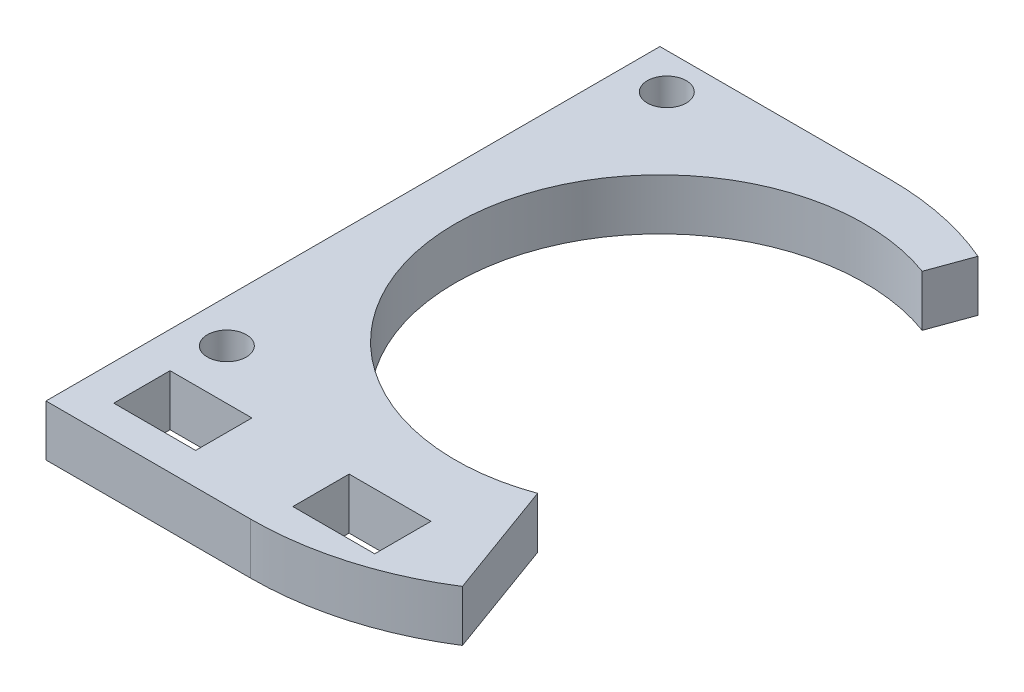
ISO-10303-21;
HEADER;
FILE_DESCRIPTION(('STEP AP214'),'2;1');
FILE_NAME('part.step','',(''),(''),'','','');
FILE_SCHEMA(('AUTOMOTIVE_DESIGN { 1 0 10303 214 1 1 1 1 }'));
ENDSEC;
DATA;
#1=APPLICATION_CONTEXT('core data for automotive mechanical design processes');
#2=APPLICATION_PROTOCOL_DEFINITION('international standard','automotive_design',2000,#1);
#3=PRODUCT_CONTEXT('',#1,'mechanical');
#4=PRODUCT('Part','Part','',(#3));
#5=PRODUCT_RELATED_PRODUCT_CATEGORY('part','',(#4));
#6=PRODUCT_DEFINITION_FORMATION('','',#4);
#7=PRODUCT_DEFINITION_CONTEXT('part definition',#1,'design');
#8=PRODUCT_DEFINITION('design','',#6,#7);
#9=PRODUCT_DEFINITION_SHAPE('','',#8);
#10=(LENGTH_UNIT() NAMED_UNIT(*) SI_UNIT(.MILLI.,.METRE.));
#11=(NAMED_UNIT(*) PLANE_ANGLE_UNIT() SI_UNIT($,.RADIAN.));
#12=(NAMED_UNIT(*) SI_UNIT($,.STERADIAN.) SOLID_ANGLE_UNIT());
#13=UNCERTAINTY_MEASURE_WITH_UNIT(LENGTH_MEASURE(1.E-05),#10,'distance_accuracy_value','');
#14=(GEOMETRIC_REPRESENTATION_CONTEXT(3) GLOBAL_UNCERTAINTY_ASSIGNED_CONTEXT((#13)) GLOBAL_UNIT_ASSIGNED_CONTEXT((#10,
#11,#12)) REPRESENTATION_CONTEXT('',''));
#15=CARTESIAN_POINT('',(0.,0.,0.));
#16=DIRECTION('',(0.,0.,1.));
#17=DIRECTION('',(1.,0.,0.));
#18=AXIS2_PLACEMENT_3D('',#15,#16,#17);
#19=CARTESIAN_POINT('',(9.,2.,-13.));
#20=DIRECTION('',(0.,1.,0.));
#21=DIRECTION('',(0.,0.,1.));
#22=AXIS2_PLACEMENT_3D('',#19,#20,#21);
#23=PLANE('',#22);
#24=DIRECTION('',(-0.342020143325673,0.,0.939692620785907));
#25=VECTOR('',#24,1.);
#26=CARTESIAN_POINT('',(14.4183359517075,2.,-26.1392782588811));
#27=LINE('',#26,#25);
#28=CARTESIAN_POINT('',(13.3182925325843,2.,-23.1169338044205));
#29=VERTEX_POINT('',#28);
#30=CARTESIAN_POINT('',(12.7361611466052,2.,-21.5175409662873));
#31=VERTEX_POINT('',#30);
#32=EDGE_CURVE('E55',#29,#31,#27,.T.);
#33=ORIENTED_EDGE('',*,*,#32,.F.);
#34=CARTESIAN_POINT('',(9.,2.,-13.));
#35=DIRECTION('',(0.,1.,0.));
#36=DIRECTION('',(0.,0.,1.));
#37=AXIS2_PLACEMENT_3D('',#34,#35,#36);
#38=CIRCLE('',#37,11.);
#39=CARTESIAN_POINT('',(9.,2.,-24.));
#40=VERTEX_POINT('',#39);
#41=EDGE_CURVE('E178',#29,#40,#38,.T.);
#42=ORIENTED_EDGE('',*,*,#41,.T.);
#43=DIRECTION('',(-1.,0.,0.));
#44=VECTOR('',#43,1.);
#45=CARTESIAN_POINT('',(0.,2.,-24.));
#46=LINE('',#45,#44);
#47=CARTESIAN_POINT('',(0.,2.,-24.));
#48=VERTEX_POINT('',#47);
#49=EDGE_CURVE('E180',#40,#48,#46,.T.);
#50=ORIENTED_EDGE('',*,*,#49,.T.);
#51=DIRECTION('',(0.,0.,1.));
#52=VECTOR('',#51,1.);
#53=CARTESIAN_POINT('',(0.,2.,0.));
#54=LINE('',#53,#52);
#55=CARTESIAN_POINT('',(0.,2.,0.));
#56=VERTEX_POINT('',#55);
#57=EDGE_CURVE('E171',#48,#56,#54,.T.);
#58=ORIENTED_EDGE('',*,*,#57,.T.);
#59=DIRECTION('',(1.,0.,0.));
#60=VECTOR('',#59,1.);
#61=CARTESIAN_POINT('',(0.,2.,0.));
#62=LINE('',#61,#60);
#63=CARTESIAN_POINT('',(8.,2.,0.));
#64=VERTEX_POINT('',#63);
#65=EDGE_CURVE('E174',#56,#64,#62,.T.);
#66=ORIENTED_EDGE('',*,*,#65,.T.);
#67=CARTESIAN_POINT('',(8.,2.,-12.));
#68=DIRECTION('',(0.,1.,0.));
#69=DIRECTION('',(0.,0.,-1.));
#70=AXIS2_PLACEMENT_3D('',#67,#68,#69);
#71=CIRCLE('',#70,12.);
#72=CARTESIAN_POINT('',(14.4183359517075,2.,-1.86072174111888));
#73=VERTEX_POINT('',#72);
#74=EDGE_CURVE('E157',#64,#73,#71,.T.);
#75=ORIENTED_EDGE('',*,*,#74,.T.);
#76=DIRECTION('',(0.342020143325673,0.,0.939692620785907));
#77=VECTOR('',#76,1.);
#78=CARTESIAN_POINT('',(12.7361611466052,2.,-6.48245903371269));
#79=LINE('',#78,#77);
#80=CARTESIAN_POINT('',(12.7361611466052,2.,-6.48245903371269));
#81=VERTEX_POINT('',#80);
#82=EDGE_CURVE('E144',#81,#73,#79,.T.);
#83=ORIENTED_EDGE('',*,*,#82,.F.);
#84=CARTESIAN_POINT('',(10.,2.,-14.));
#85=DIRECTION('',(0.,1.,0.));
#86=DIRECTION('',(0.,0.,1.));
#87=AXIS2_PLACEMENT_3D('',#84,#85,#86);
#88=CIRCLE('',#87,8.);
#89=EDGE_CURVE('E155',#31,#81,#88,.T.);
#90=ORIENTED_EDGE('',*,*,#89,.F.);
#91=EDGE_LOOP('',(#33,#42,#50,#58,#66,#75,#83,#90));
#92=FACE_BOUND('',#91,.T.);
#93=CARTESIAN_POINT('',(1.67,2.,-22.6));
#94=DIRECTION('',(0.,1.,0.));
#95=DIRECTION('',(0.,0.,1.));
#96=AXIS2_PLACEMENT_3D('',#93,#94,#95);
#97=CIRCLE('',#96,0.759999999999998);
#98=CARTESIAN_POINT('',(1.67,2.,-21.84));
#99=VERTEX_POINT('',#98);
#100=EDGE_CURVE('E264',#99,#99,#97,.T.);
#101=ORIENTED_EDGE('',*,*,#100,.F.);
#102=EDGE_LOOP('',(#101));
#103=FACE_BOUND('',#102,.T.);
#104=DIRECTION('',(-1.,0.,0.));
#105=VECTOR('',#104,1.);
#106=CARTESIAN_POINT('',(8.4,2.,-3.45));
#107=LINE('',#106,#105);
#108=CARTESIAN_POINT('',(11.6,2.,-3.45));
#109=VERTEX_POINT('',#108);
#110=CARTESIAN_POINT('',(8.4,2.,-3.45));
#111=VERTEX_POINT('',#110);
#112=EDGE_CURVE('E272',#109,#111,#107,.T.);
#113=ORIENTED_EDGE('',*,*,#112,.F.);
#114=DIRECTION('',(0.,0.,-1.));
#115=VECTOR('',#114,1.);
#116=CARTESIAN_POINT('',(11.6,2.,-3.45));
#117=LINE('',#116,#115);
#118=CARTESIAN_POINT('',(11.6,2.,-1.25));
#119=VERTEX_POINT('',#118);
#120=EDGE_CURVE('E270',#119,#109,#117,.T.);
#121=ORIENTED_EDGE('',*,*,#120,.F.);
#122=DIRECTION('',(1.,0.,0.));
#123=VECTOR('',#122,1.);
#124=CARTESIAN_POINT('',(8.4,2.,-1.25));
#125=LINE('',#124,#123);
#126=CARTESIAN_POINT('',(8.4,2.,-1.25));
#127=VERTEX_POINT('',#126);
#128=EDGE_CURVE('E278',#127,#119,#125,.T.);
#129=ORIENTED_EDGE('',*,*,#128,.F.);
#130=DIRECTION('',(0.,0.,1.));
#131=VECTOR('',#130,1.);
#132=CARTESIAN_POINT('',(8.4,2.,-3.45));
#133=LINE('',#132,#131);
#134=EDGE_CURVE('E275',#111,#127,#133,.T.);
#135=ORIENTED_EDGE('',*,*,#134,.F.);
#136=EDGE_LOOP('',(#113,#121,#129,#135));
#137=FACE_BOUND('',#136,.T.);
#138=CARTESIAN_POINT('',(1.67,2.,-5.4));
#139=DIRECTION('',(0.,1.,0.));
#140=DIRECTION('',(0.,0.,-1.));
#141=AXIS2_PLACEMENT_3D('',#138,#139,#140);
#142=CIRCLE('',#141,0.759999999999999);
#143=CARTESIAN_POINT('',(1.67,2.,-6.16));
#144=VERTEX_POINT('',#143);
#145=EDGE_CURVE('E258',#144,#144,#142,.T.);
#146=ORIENTED_EDGE('',*,*,#145,.F.);
#147=EDGE_LOOP('',(#146));
#148=FACE_BOUND('',#147,.T.);
#149=DIRECTION('',(0.,0.,1.));
#150=VECTOR('',#149,1.);
#151=CARTESIAN_POINT('',(1.4,2.,-3.45));
#152=LINE('',#151,#150);
#153=CARTESIAN_POINT('',(1.4,2.,-3.45));
#154=VERTEX_POINT('',#153);
#155=CARTESIAN_POINT('',(1.4,2.,-1.25));
#156=VERTEX_POINT('',#155);
#157=EDGE_CURVE('E229',#154,#156,#152,.T.);
#158=ORIENTED_EDGE('',*,*,#157,.F.);
#159=DIRECTION('',(-1.,0.,0.));
#160=VECTOR('',#159,1.);
#161=CARTESIAN_POINT('',(4.6,2.,-3.45));
#162=LINE('',#161,#160);
#163=CARTESIAN_POINT('',(4.6,2.,-3.45));
#164=VERTEX_POINT('',#163);
#165=EDGE_CURVE('E227',#164,#154,#162,.T.);
#166=ORIENTED_EDGE('',*,*,#165,.F.);
#167=DIRECTION('',(0.,0.,-1.));
#168=VECTOR('',#167,1.);
#169=CARTESIAN_POINT('',(4.6,2.,-3.45));
#170=LINE('',#169,#168);
#171=CARTESIAN_POINT('',(4.6,2.,-1.25));
#172=VERTEX_POINT('',#171);
#173=EDGE_CURVE('E235',#172,#164,#170,.T.);
#174=ORIENTED_EDGE('',*,*,#173,.F.);
#175=DIRECTION('',(1.,0.,0.));
#176=VECTOR('',#175,1.);
#177=CARTESIAN_POINT('',(4.6,2.,-1.25));
#178=LINE('',#177,#176);
#179=EDGE_CURVE('E232',#156,#172,#178,.T.);
#180=ORIENTED_EDGE('',*,*,#179,.F.);
#181=EDGE_LOOP('',(#158,#166,#174,#180));
#182=FACE_BOUND('',#181,.T.);
#183=ADVANCED_FACE('F33',(#92,#103,#137,#148,#182),#23,.T.);
#184=CARTESIAN_POINT('',(9.,0.,-13.));
#185=DIRECTION('',(0.,1.,0.));
#186=DIRECTION('',(0.,0.,1.));
#187=AXIS2_PLACEMENT_3D('',#184,#185,#186);
#188=PLANE('',#187);
#189=CARTESIAN_POINT('',(1.67,0.,-5.4));
#190=DIRECTION('',(0.,1.,0.));
#191=DIRECTION('',(0.,0.,-1.));
#192=AXIS2_PLACEMENT_3D('',#189,#190,#191);
#193=CIRCLE('',#192,0.759999999999999);
#194=CARTESIAN_POINT('',(1.67,0.,-6.16));
#195=VERTEX_POINT('',#194);
#196=EDGE_CURVE('E257',#195,#195,#193,.T.);
#197=ORIENTED_EDGE('',*,*,#196,.T.);
#198=EDGE_LOOP('',(#197));
#199=FACE_BOUND('',#198,.T.);
#200=CARTESIAN_POINT('',(1.67,0.,-22.6));
#201=DIRECTION('',(0.,1.,0.));
#202=DIRECTION('',(0.,0.,1.));
#203=AXIS2_PLACEMENT_3D('',#200,#201,#202);
#204=CIRCLE('',#203,0.759999999999998);
#205=CARTESIAN_POINT('',(1.67,0.,-21.84));
#206=VERTEX_POINT('',#205);
#207=EDGE_CURVE('E261',#206,#206,#204,.T.);
#208=ORIENTED_EDGE('',*,*,#207,.T.);
#209=EDGE_LOOP('',(#208));
#210=FACE_BOUND('',#209,.T.);
#211=DIRECTION('',(0.,0.,-1.));
#212=VECTOR('',#211,1.);
#213=CARTESIAN_POINT('',(11.6,0.,-3.45));
#214=LINE('',#213,#212);
#215=CARTESIAN_POINT('',(11.6,0.,-1.25));
#216=VERTEX_POINT('',#215);
#217=CARTESIAN_POINT('',(11.6,0.,-3.45));
#218=VERTEX_POINT('',#217);
#219=EDGE_CURVE('E267',#216,#218,#214,.T.);
#220=ORIENTED_EDGE('',*,*,#219,.T.);
#221=DIRECTION('',(-1.,0.,0.));
#222=VECTOR('',#221,1.);
#223=CARTESIAN_POINT('',(8.4,0.,-3.45));
#224=LINE('',#223,#222);
#225=CARTESIAN_POINT('',(8.4,0.,-3.45));
#226=VERTEX_POINT('',#225);
#227=EDGE_CURVE('E283',#218,#226,#224,.T.);
#228=ORIENTED_EDGE('',*,*,#227,.T.);
#229=DIRECTION('',(0.,0.,1.));
#230=VECTOR('',#229,1.);
#231=CARTESIAN_POINT('',(8.4,0.,-3.45));
#232=LINE('',#231,#230);
#233=CARTESIAN_POINT('',(8.4,0.,-1.25));
#234=VERTEX_POINT('',#233);
#235=EDGE_CURVE('E286',#226,#234,#232,.T.);
#236=ORIENTED_EDGE('',*,*,#235,.T.);
#237=DIRECTION('',(1.,0.,0.));
#238=VECTOR('',#237,1.);
#239=CARTESIAN_POINT('',(8.4,0.,-1.25));
#240=LINE('',#239,#238);
#241=EDGE_CURVE('E273',#234,#216,#240,.T.);
#242=ORIENTED_EDGE('',*,*,#241,.T.);
#243=EDGE_LOOP('',(#220,#228,#236,#242));
#244=FACE_BOUND('',#243,.T.);
#245=CARTESIAN_POINT('',(9.,0.,-13.));
#246=DIRECTION('',(0.,1.,0.));
#247=DIRECTION('',(0.,0.,1.));
#248=AXIS2_PLACEMENT_3D('',#245,#246,#247);
#249=CIRCLE('',#248,11.);
#250=CARTESIAN_POINT('',(13.3182925325843,0.,-23.1169338044205));
#251=VERTEX_POINT('',#250);
#252=CARTESIAN_POINT('',(9.,0.,-24.));
#253=VERTEX_POINT('',#252);
#254=EDGE_CURVE('E187',#251,#253,#249,.T.);
#255=ORIENTED_EDGE('',*,*,#254,.F.);
#256=DIRECTION('',(-0.342020143325673,0.,0.939692620785907));
#257=VECTOR('',#256,1.);
#258=CARTESIAN_POINT('',(9.56162841671605,0.,-12.7955839735973));
#259=LINE('',#258,#257);
#260=CARTESIAN_POINT('',(12.7361611466052,0.,-21.5175409662873));
#261=VERTEX_POINT('',#260);
#262=EDGE_CURVE('E223',#251,#261,#259,.T.);
#263=ORIENTED_EDGE('',*,*,#262,.T.);
#264=CARTESIAN_POINT('',(10.,0.,-14.));
#265=DIRECTION('',(0.,1.,0.));
#266=DIRECTION('',(0.,0.,1.));
#267=AXIS2_PLACEMENT_3D('',#264,#265,#266);
#268=CIRCLE('',#267,8.);
#269=CARTESIAN_POINT('',(12.7361611466052,0.,-6.48245903371268));
#270=VERTEX_POINT('',#269);
#271=EDGE_CURVE('E161',#261,#270,#268,.T.);
#272=ORIENTED_EDGE('',*,*,#271,.T.);
#273=DIRECTION('',(0.342020143325673,0.,0.939692620785907));
#274=VECTOR('',#273,1.);
#275=CARTESIAN_POINT('',(10.2044160264026,0.,-13.4383715832837));
#276=LINE('',#275,#274);
#277=CARTESIAN_POINT('',(14.4183359517075,0.,-1.86072174111888));
#278=VERTEX_POINT('',#277);
#279=EDGE_CURVE('E48',#270,#278,#276,.T.);
#280=ORIENTED_EDGE('',*,*,#279,.T.);
#281=CARTESIAN_POINT('',(8.,0.,-12.));
#282=DIRECTION('',(0.,1.,0.));
#283=DIRECTION('',(0.,0.,-1.));
#284=AXIS2_PLACEMENT_3D('',#281,#282,#283);
#285=CIRCLE('',#284,12.);
#286=CARTESIAN_POINT('',(8.,0.,0.));
#287=VERTEX_POINT('',#286);
#288=EDGE_CURVE('E184',#287,#278,#285,.T.);
#289=ORIENTED_EDGE('',*,*,#288,.F.);
#290=DIRECTION('',(1.,0.,0.));
#291=VECTOR('',#290,1.);
#292=CARTESIAN_POINT('',(0.,0.,0.));
#293=LINE('',#292,#291);
#294=CARTESIAN_POINT('',(0.,0.,0.));
#295=VERTEX_POINT('',#294);
#296=EDGE_CURVE('E164',#295,#287,#293,.T.);
#297=ORIENTED_EDGE('',*,*,#296,.F.);
#298=DIRECTION('',(0.,0.,1.));
#299=VECTOR('',#298,1.);
#300=CARTESIAN_POINT('',(0.,0.,0.));
#301=LINE('',#300,#299);
#302=CARTESIAN_POINT('',(0.,0.,-24.));
#303=VERTEX_POINT('',#302);
#304=EDGE_CURVE('E160',#303,#295,#301,.T.);
#305=ORIENTED_EDGE('',*,*,#304,.F.);
#306=DIRECTION('',(-1.,0.,0.));
#307=VECTOR('',#306,1.);
#308=CARTESIAN_POINT('',(0.,0.,-24.));
#309=LINE('',#308,#307);
#310=EDGE_CURVE('E175',#253,#303,#309,.T.);
#311=ORIENTED_EDGE('',*,*,#310,.F.);
#312=EDGE_LOOP('',(#255,#263,#272,#280,#289,#297,#305,#311));
#313=FACE_BOUND('',#312,.T.);
#314=DIRECTION('',(-1.,0.,0.));
#315=VECTOR('',#314,1.);
#316=CARTESIAN_POINT('',(4.6,0.,-3.45));
#317=LINE('',#316,#315);
#318=CARTESIAN_POINT('',(4.6,0.,-3.45));
#319=VERTEX_POINT('',#318);
#320=CARTESIAN_POINT('',(1.4,0.,-3.45));
#321=VERTEX_POINT('',#320);
#322=EDGE_CURVE('E226',#319,#321,#317,.T.);
#323=ORIENTED_EDGE('',*,*,#322,.T.);
#324=DIRECTION('',(0.,0.,1.));
#325=VECTOR('',#324,1.);
#326=CARTESIAN_POINT('',(1.4,0.,-3.45));
#327=LINE('',#326,#325);
#328=CARTESIAN_POINT('',(1.4,0.,-1.25));
#329=VERTEX_POINT('',#328);
#330=EDGE_CURVE('E240',#321,#329,#327,.T.);
#331=ORIENTED_EDGE('',*,*,#330,.T.);
#332=DIRECTION('',(1.,0.,0.));
#333=VECTOR('',#332,1.);
#334=CARTESIAN_POINT('',(4.6,0.,-1.25));
#335=LINE('',#334,#333);
#336=CARTESIAN_POINT('',(4.6,0.,-1.25));
#337=VERTEX_POINT('',#336);
#338=EDGE_CURVE('E243',#329,#337,#335,.T.);
#339=ORIENTED_EDGE('',*,*,#338,.T.);
#340=DIRECTION('',(0.,0.,-1.));
#341=VECTOR('',#340,1.);
#342=CARTESIAN_POINT('',(4.6,0.,-3.45));
#343=LINE('',#342,#341);
#344=EDGE_CURVE('E230',#337,#319,#343,.T.);
#345=ORIENTED_EDGE('',*,*,#344,.T.);
#346=EDGE_LOOP('',(#323,#331,#339,#345));
#347=FACE_BOUND('',#346,.T.);
#348=ADVANCED_FACE('F210',(#199,#210,#244,#313,#347),#188,.F.);
#349=CARTESIAN_POINT('',(0.,2.,0.));
#350=DIRECTION('',(1.,0.,0.));
#351=DIRECTION('',(0.,0.,-1.));
#352=AXIS2_PLACEMENT_3D('',#349,#350,#351);
#353=PLANE('',#352);
#354=ORIENTED_EDGE('',*,*,#304,.T.);
#355=DIRECTION('',(0.,-1.,0.));
#356=VECTOR('',#355,1.);
#357=CARTESIAN_POINT('',(0.,2.,0.));
#358=LINE('',#357,#356);
#359=EDGE_CURVE('E150',#56,#295,#358,.T.);
#360=ORIENTED_EDGE('',*,*,#359,.F.);
#361=ORIENTED_EDGE('',*,*,#57,.F.);
#362=DIRECTION('',(0.,-1.,0.));
#363=VECTOR('',#362,1.);
#364=CARTESIAN_POINT('',(0.,2.,-24.));
#365=LINE('',#364,#363);
#366=EDGE_CURVE('E181',#48,#303,#365,.T.);
#367=ORIENTED_EDGE('',*,*,#366,.T.);
#368=EDGE_LOOP('',(#354,#360,#361,#367));
#369=FACE_BOUND('',#368,.T.);
#370=ADVANCED_FACE('F35',(#369),#353,.F.);
#371=CARTESIAN_POINT('',(0.,2.,0.));
#372=DIRECTION('',(0.,0.,-1.));
#373=DIRECTION('',(-1.,0.,0.));
#374=AXIS2_PLACEMENT_3D('',#371,#372,#373);
#375=PLANE('',#374);
#376=ORIENTED_EDGE('',*,*,#296,.T.);
#377=DIRECTION('',(0.,-1.,0.));
#378=VECTOR('',#377,1.);
#379=CARTESIAN_POINT('',(8.,2.,0.));
#380=LINE('',#379,#378);
#381=EDGE_CURVE('E195',#64,#287,#380,.T.);
#382=ORIENTED_EDGE('',*,*,#381,.F.);
#383=ORIENTED_EDGE('',*,*,#65,.F.);
#384=ORIENTED_EDGE('',*,*,#359,.T.);
#385=EDGE_LOOP('',(#376,#382,#383,#384));
#386=FACE_BOUND('',#385,.T.);
#387=ADVANCED_FACE('F201',(#386),#375,.F.);
#388=CARTESIAN_POINT('',(8.,2.,-12.));
#389=DIRECTION('',(0.,-1.,0.));
#390=DIRECTION('',(0.,0.,-1.));
#391=AXIS2_PLACEMENT_3D('',#388,#389,#390);
#392=CYLINDRICAL_SURFACE('',#391,12.);
#393=ORIENTED_EDGE('',*,*,#288,.T.);
#394=DIRECTION('',(0.,1.,0.));
#395=VECTOR('',#394,1.);
#396=CARTESIAN_POINT('',(14.4183359517075,-8.,-1.86072174111888));
#397=LINE('',#396,#395);
#398=EDGE_CURVE('E215',#278,#73,#397,.T.);
#399=ORIENTED_EDGE('',*,*,#398,.T.);
#400=ORIENTED_EDGE('',*,*,#74,.F.);
#401=ORIENTED_EDGE('',*,*,#381,.T.);
#402=EDGE_LOOP('',(#393,#399,#400,#401));
#403=FACE_BOUND('',#402,.T.);
#404=ADVANCED_FACE('F214',(#403),#392,.T.);
#405=CARTESIAN_POINT('',(9.,2.,-13.));
#406=DIRECTION('',(0.,-1.,0.));
#407=DIRECTION('',(0.,0.,-1.));
#408=AXIS2_PLACEMENT_3D('',#405,#406,#407);
#409=CYLINDRICAL_SURFACE('',#408,11.);
#410=ORIENTED_EDGE('',*,*,#41,.F.);
#411=DIRECTION('',(0.,-1.,0.));
#412=VECTOR('',#411,1.);
#413=CARTESIAN_POINT('',(13.3182925325843,2.,-23.1169338044205));
#414=LINE('',#413,#412);
#415=EDGE_CURVE('E217',#29,#251,#414,.T.);
#416=ORIENTED_EDGE('',*,*,#415,.T.);
#417=ORIENTED_EDGE('',*,*,#254,.T.);
#418=DIRECTION('',(0.,-1.,0.));
#419=VECTOR('',#418,1.);
#420=CARTESIAN_POINT('',(9.,2.,-24.));
#421=LINE('',#420,#419);
#422=EDGE_CURVE('E192',#40,#253,#421,.T.);
#423=ORIENTED_EDGE('',*,*,#422,.F.);
#424=EDGE_LOOP('',(#410,#416,#417,#423));
#425=FACE_BOUND('',#424,.T.);
#426=ADVANCED_FACE('F338',(#425),#409,.T.);
#427=CARTESIAN_POINT('',(0.,2.,-24.));
#428=DIRECTION('',(0.,0.,1.));
#429=DIRECTION('',(1.,0.,0.));
#430=AXIS2_PLACEMENT_3D('',#427,#428,#429);
#431=PLANE('',#430);
#432=ORIENTED_EDGE('',*,*,#310,.T.);
#433=ORIENTED_EDGE('',*,*,#366,.F.);
#434=ORIENTED_EDGE('',*,*,#49,.F.);
#435=ORIENTED_EDGE('',*,*,#422,.T.);
#436=EDGE_LOOP('',(#432,#433,#434,#435));
#437=FACE_BOUND('',#436,.T.);
#438=ADVANCED_FACE('F335',(#437),#431,.F.);
#439=CARTESIAN_POINT('',(10.,2.,-14.));
#440=DIRECTION('',(0.,-1.,0.));
#441=DIRECTION('',(0.,0.,-1.));
#442=AXIS2_PLACEMENT_3D('',#439,#440,#441);
#443=CYLINDRICAL_SURFACE('',#442,8.);
#444=DIRECTION('',(0.,-1.,0.));
#445=VECTOR('',#444,1.);
#446=CARTESIAN_POINT('',(12.7361611466052,2.,-21.5175409662873));
#447=LINE('',#446,#445);
#448=EDGE_CURVE('E11',#31,#261,#447,.T.);
#449=ORIENTED_EDGE('',*,*,#448,.F.);
#450=ORIENTED_EDGE('',*,*,#89,.T.);
#451=DIRECTION('',(0.,-1.,0.));
#452=VECTOR('',#451,1.);
#453=CARTESIAN_POINT('',(12.7361611466052,2.,-6.48245903371268));
#454=LINE('',#453,#452);
#455=EDGE_CURVE('E41',#270,#81,#454,.F.);
#456=ORIENTED_EDGE('',*,*,#455,.F.);
#457=ORIENTED_EDGE('',*,*,#271,.F.);
#458=EDGE_LOOP('',(#449,#450,#456,#457));
#459=FACE_BOUND('',#458,.T.);
#460=ADVANCED_FACE('F159',(#459),#443,.F.);
#461=CARTESIAN_POINT('',(11.6,2.,-3.45));
#462=DIRECTION('',(-1.,0.,0.));
#463=DIRECTION('',(0.,0.,1.));
#464=AXIS2_PLACEMENT_3D('',#461,#462,#463);
#465=PLANE('',#464);
#466=ORIENTED_EDGE('',*,*,#219,.F.);
#467=DIRECTION('',(0.,-1.,0.));
#468=VECTOR('',#467,1.);
#469=CARTESIAN_POINT('',(11.6,2.,-1.25));
#470=LINE('',#469,#468);
#471=EDGE_CURVE('E280',#119,#216,#470,.T.);
#472=ORIENTED_EDGE('',*,*,#471,.F.);
#473=ORIENTED_EDGE('',*,*,#120,.T.);
#474=DIRECTION('',(0.,-1.,0.));
#475=VECTOR('',#474,1.);
#476=CARTESIAN_POINT('',(11.6,2.,-3.45));
#477=LINE('',#476,#475);
#478=EDGE_CURVE('E166',#109,#218,#477,.T.);
#479=ORIENTED_EDGE('',*,*,#478,.T.);
#480=EDGE_LOOP('',(#466,#472,#473,#479));
#481=FACE_BOUND('',#480,.T.);
#482=ADVANCED_FACE('F301',(#481),#465,.T.);
#483=CARTESIAN_POINT('',(8.4,2.,-3.45));
#484=DIRECTION('',(0.,0.,1.));
#485=DIRECTION('',(1.,0.,0.));
#486=AXIS2_PLACEMENT_3D('',#483,#484,#485);
#487=PLANE('',#486);
#488=ORIENTED_EDGE('',*,*,#227,.F.);
#489=ORIENTED_EDGE('',*,*,#478,.F.);
#490=ORIENTED_EDGE('',*,*,#112,.T.);
#491=DIRECTION('',(0.,-1.,0.));
#492=VECTOR('',#491,1.);
#493=CARTESIAN_POINT('',(8.4,2.,-3.45));
#494=LINE('',#493,#492);
#495=EDGE_CURVE('E294',#111,#226,#494,.T.);
#496=ORIENTED_EDGE('',*,*,#495,.T.);
#497=EDGE_LOOP('',(#488,#489,#490,#496));
#498=FACE_BOUND('',#497,.T.);
#499=ADVANCED_FACE('F313',(#498),#487,.T.);
#500=CARTESIAN_POINT('',(8.4,2.,-3.45));
#501=DIRECTION('',(1.,0.,0.));
#502=DIRECTION('',(0.,0.,-1.));
#503=AXIS2_PLACEMENT_3D('',#500,#501,#502);
#504=PLANE('',#503);
#505=ORIENTED_EDGE('',*,*,#235,.F.);
#506=ORIENTED_EDGE('',*,*,#495,.F.);
#507=ORIENTED_EDGE('',*,*,#134,.T.);
#508=DIRECTION('',(0.,-1.,0.));
#509=VECTOR('',#508,1.);
#510=CARTESIAN_POINT('',(8.4,2.,-1.25));
#511=LINE('',#510,#509);
#512=EDGE_CURVE('E293',#127,#234,#511,.T.);
#513=ORIENTED_EDGE('',*,*,#512,.T.);
#514=EDGE_LOOP('',(#505,#506,#507,#513));
#515=FACE_BOUND('',#514,.T.);
#516=ADVANCED_FACE('F315',(#515),#504,.T.);
#517=CARTESIAN_POINT('',(8.4,2.,-1.25));
#518=DIRECTION('',(0.,0.,-1.));
#519=DIRECTION('',(-1.,0.,0.));
#520=AXIS2_PLACEMENT_3D('',#517,#518,#519);
#521=PLANE('',#520);
#522=ORIENTED_EDGE('',*,*,#241,.F.);
#523=ORIENTED_EDGE('',*,*,#512,.F.);
#524=ORIENTED_EDGE('',*,*,#128,.T.);
#525=ORIENTED_EDGE('',*,*,#471,.T.);
#526=EDGE_LOOP('',(#522,#523,#524,#525));
#527=FACE_BOUND('',#526,.T.);
#528=ADVANCED_FACE('F308',(#527),#521,.T.);
#529=CARTESIAN_POINT('',(1.67,2.,-22.6));
#530=DIRECTION('',(0.,-1.,0.));
#531=DIRECTION('',(0.,0.,-1.));
#532=AXIS2_PLACEMENT_3D('',#529,#530,#531);
#533=CYLINDRICAL_SURFACE('',#532,0.759999999999998);
#534=ORIENTED_EDGE('',*,*,#100,.T.);
#535=EDGE_LOOP('',(#534));
#536=FACE_BOUND('',#535,.T.);
#537=ORIENTED_EDGE('',*,*,#207,.F.);
#538=EDGE_LOOP('',(#537));
#539=FACE_BOUND('',#538,.T.);
#540=ADVANCED_FACE('F322',(#536,#539),#533,.F.);
#541=CARTESIAN_POINT('',(1.67,2.,-5.4));
#542=DIRECTION('',(0.,-1.,0.));
#543=DIRECTION('',(0.,0.,-1.));
#544=AXIS2_PLACEMENT_3D('',#541,#542,#543);
#545=CYLINDRICAL_SURFACE('',#544,0.759999999999999);
#546=ORIENTED_EDGE('',*,*,#145,.T.);
#547=EDGE_LOOP('',(#546));
#548=FACE_BOUND('',#547,.T.);
#549=ORIENTED_EDGE('',*,*,#196,.F.);
#550=EDGE_LOOP('',(#549));
#551=FACE_BOUND('',#550,.T.);
#552=ADVANCED_FACE('F418',(#548,#551),#545,.F.);
#553=CARTESIAN_POINT('',(4.6,2.,-3.45));
#554=DIRECTION('',(0.,0.,1.));
#555=DIRECTION('',(1.,0.,0.));
#556=AXIS2_PLACEMENT_3D('',#553,#554,#555);
#557=PLANE('',#556);
#558=ORIENTED_EDGE('',*,*,#322,.F.);
#559=DIRECTION('',(0.,-1.,0.));
#560=VECTOR('',#559,1.);
#561=CARTESIAN_POINT('',(4.6,2.,-3.45));
#562=LINE('',#561,#560);
#563=EDGE_CURVE('E237',#164,#319,#562,.T.);
#564=ORIENTED_EDGE('',*,*,#563,.F.);
#565=ORIENTED_EDGE('',*,*,#165,.T.);
#566=DIRECTION('',(0.,-1.,0.));
#567=VECTOR('',#566,1.);
#568=CARTESIAN_POINT('',(1.4,2.,-3.45));
#569=LINE('',#568,#567);
#570=EDGE_CURVE('E254',#154,#321,#569,.T.);
#571=ORIENTED_EDGE('',*,*,#570,.T.);
#572=EDGE_LOOP('',(#558,#564,#565,#571));
#573=FACE_BOUND('',#572,.T.);
#574=ADVANCED_FACE('F414',(#573),#557,.T.);
#575=CARTESIAN_POINT('',(1.4,2.,-3.45));
#576=DIRECTION('',(1.,0.,0.));
#577=DIRECTION('',(0.,0.,-1.));
#578=AXIS2_PLACEMENT_3D('',#575,#576,#577);
#579=PLANE('',#578);
#580=ORIENTED_EDGE('',*,*,#330,.F.);
#581=ORIENTED_EDGE('',*,*,#570,.F.);
#582=ORIENTED_EDGE('',*,*,#157,.T.);
#583=DIRECTION('',(0.,-1.,0.));
#584=VECTOR('',#583,1.);
#585=CARTESIAN_POINT('',(1.4,2.,-1.25));
#586=LINE('',#585,#584);
#587=EDGE_CURVE('E252',#156,#329,#586,.T.);
#588=ORIENTED_EDGE('',*,*,#587,.T.);
#589=EDGE_LOOP('',(#580,#581,#582,#588));
#590=FACE_BOUND('',#589,.T.);
#591=ADVANCED_FACE('F410',(#590),#579,.T.);
#592=CARTESIAN_POINT('',(4.6,2.,-1.25));
#593=DIRECTION('',(0.,0.,-1.));
#594=DIRECTION('',(-1.,0.,0.));
#595=AXIS2_PLACEMENT_3D('',#592,#593,#594);
#596=PLANE('',#595);
#597=ORIENTED_EDGE('',*,*,#338,.F.);
#598=ORIENTED_EDGE('',*,*,#587,.F.);
#599=ORIENTED_EDGE('',*,*,#179,.T.);
#600=DIRECTION('',(0.,-1.,0.));
#601=VECTOR('',#600,1.);
#602=CARTESIAN_POINT('',(4.6,2.,-1.25));
#603=LINE('',#602,#601);
#604=EDGE_CURVE('E250',#172,#337,#603,.T.);
#605=ORIENTED_EDGE('',*,*,#604,.T.);
#606=EDGE_LOOP('',(#597,#598,#599,#605));
#607=FACE_BOUND('',#606,.T.);
#608=ADVANCED_FACE('F406',(#607),#596,.T.);
#609=CARTESIAN_POINT('',(4.6,2.,-3.45));
#610=DIRECTION('',(-1.,0.,0.));
#611=DIRECTION('',(0.,0.,1.));
#612=AXIS2_PLACEMENT_3D('',#609,#610,#611);
#613=PLANE('',#612);
#614=ORIENTED_EDGE('',*,*,#344,.F.);
#615=ORIENTED_EDGE('',*,*,#604,.F.);
#616=ORIENTED_EDGE('',*,*,#173,.T.);
#617=ORIENTED_EDGE('',*,*,#563,.T.);
#618=EDGE_LOOP('',(#614,#615,#616,#617));
#619=FACE_BOUND('',#618,.T.);
#620=ADVANCED_FACE('F390',(#619),#613,.T.);
#621=CARTESIAN_POINT('',(12.7361611466052,-8.,-6.48245903371269));
#622=DIRECTION('',(-0.939692620785907,0.,0.342020143325673));
#623=DIRECTION('',(0.342020143325673,0.,0.939692620785907));
#624=AXIS2_PLACEMENT_3D('',#621,#622,#623);
#625=PLANE('',#624);
#626=ORIENTED_EDGE('',*,*,#455,.T.);
#627=ORIENTED_EDGE('',*,*,#82,.T.);
#628=ORIENTED_EDGE('',*,*,#398,.F.);
#629=ORIENTED_EDGE('',*,*,#279,.F.);
#630=EDGE_LOOP('',(#626,#627,#628,#629));
#631=FACE_BOUND('',#630,.T.);
#632=ADVANCED_FACE('F143',(#631),#625,.F.);
#633=CARTESIAN_POINT('',(14.4183359517075,-8.,-26.1392782588811));
#634=DIRECTION('',(-0.939692620785907,0.,-0.342020143325673));
#635=DIRECTION('',(-0.342020143325673,0.,0.939692620785907));
#636=AXIS2_PLACEMENT_3D('',#633,#634,#635);
#637=PLANE('',#636);
#638=ORIENTED_EDGE('',*,*,#415,.F.);
#639=ORIENTED_EDGE('',*,*,#32,.T.);
#640=ORIENTED_EDGE('',*,*,#448,.T.);
#641=ORIENTED_EDGE('',*,*,#262,.F.);
#642=EDGE_LOOP('',(#638,#639,#640,#641));
#643=FACE_BOUND('',#642,.T.);
#644=ADVANCED_FACE('F389',(#643),#637,.F.);
#645=CLOSED_SHELL('',(#183,#348,#370,#387,#404,#426,#438,#460,#482,#499,#516,#528,#540,#552,
#574,#591,#608,#620,#632,#644));
#646=MANIFOLD_SOLID_BREP('B2',#645);
#647=ADVANCED_BREP_SHAPE_REPRESENTATION('',(#18,#646),#14);
#648=SHAPE_DEFINITION_REPRESENTATION(#9,#647);
ENDSEC;
END-ISO-10303-21;
